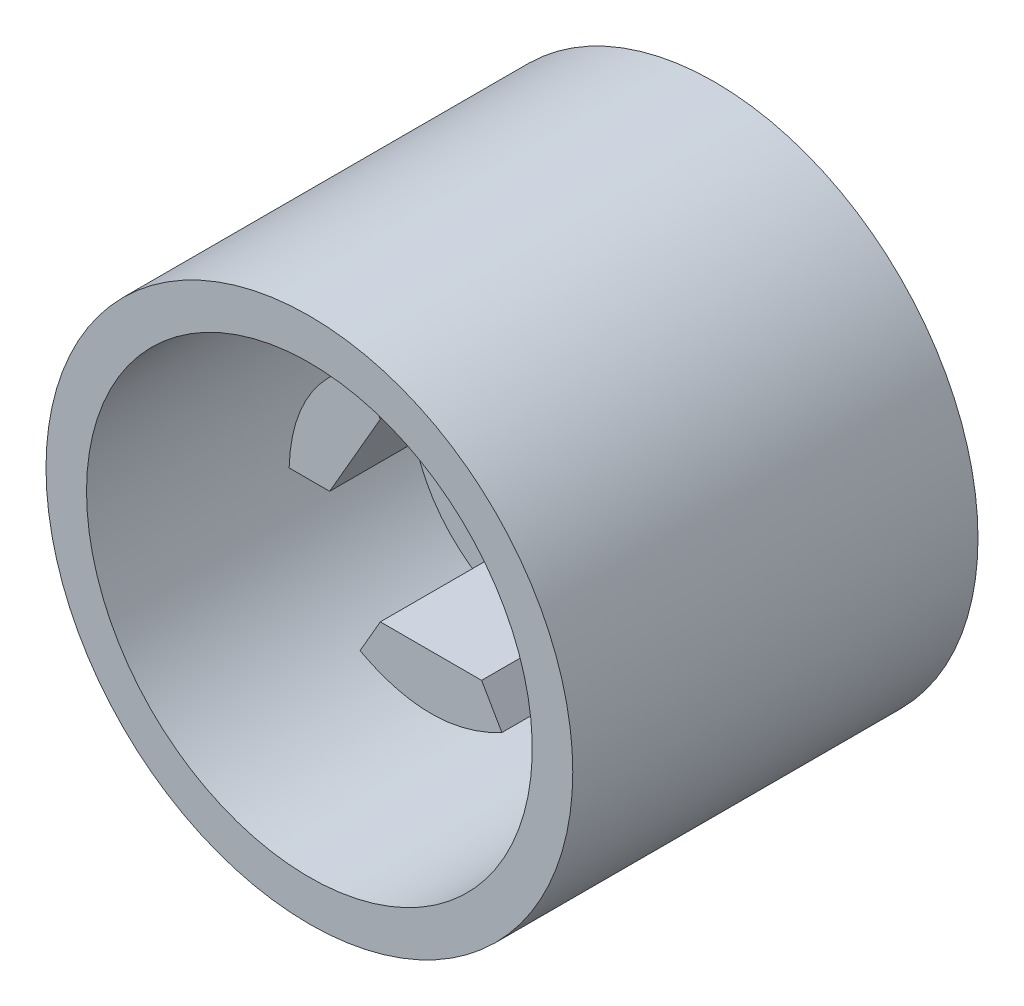
ISO-10303-21;
HEADER;
FILE_DESCRIPTION(('STEP AP214'),'2;1');
FILE_NAME('part.step','',(''),(''),'','','');
FILE_SCHEMA(('AUTOMOTIVE_DESIGN { 1 0 10303 214 1 1 1 1 }'));
ENDSEC;
DATA;
#1=APPLICATION_CONTEXT('core data for automotive mechanical design processes');
#2=APPLICATION_PROTOCOL_DEFINITION('international standard','automotive_design',2000,#1);
#3=PRODUCT_CONTEXT('',#1,'mechanical');
#4=PRODUCT('Part','Part','',(#3));
#5=PRODUCT_RELATED_PRODUCT_CATEGORY('part','',(#4));
#6=PRODUCT_DEFINITION_FORMATION('','',#4);
#7=PRODUCT_DEFINITION_CONTEXT('part definition',#1,'design');
#8=PRODUCT_DEFINITION('design','',#6,#7);
#9=PRODUCT_DEFINITION_SHAPE('','',#8);
#10=(LENGTH_UNIT() NAMED_UNIT(*) SI_UNIT(.MILLI.,.METRE.));
#11=(NAMED_UNIT(*) PLANE_ANGLE_UNIT() SI_UNIT($,.RADIAN.));
#12=(NAMED_UNIT(*) SI_UNIT($,.STERADIAN.) SOLID_ANGLE_UNIT());
#13=UNCERTAINTY_MEASURE_WITH_UNIT(LENGTH_MEASURE(1.E-05),#10,'distance_accuracy_value','');
#14=(GEOMETRIC_REPRESENTATION_CONTEXT(3) GLOBAL_UNCERTAINTY_ASSIGNED_CONTEXT((#13)) GLOBAL_UNIT_ASSIGNED_CONTEXT((#10,
#11,#12)) REPRESENTATION_CONTEXT('',''));
#15=CARTESIAN_POINT('',(0.,0.,0.));
#16=DIRECTION('',(0.,0.,1.));
#17=DIRECTION('',(1.,0.,0.));
#18=AXIS2_PLACEMENT_3D('',#15,#16,#17);
#19=CARTESIAN_POINT('',(0.,0.,-6.28644006717656));
#20=DIRECTION('',(0.,0.,-1.));
#21=DIRECTION('',(-1.,0.,0.));
#22=AXIS2_PLACEMENT_3D('',#19,#20,#21);
#23=PLANE('',#22);
#24=DIRECTION('',(-0.499999999999991,-0.866025403784443,0.));
#25=VECTOR('',#24,1.);
#26=CARTESIAN_POINT('',(-6.82616625304671,-3.43703832126951,-6.28644006717656));
#27=LINE('',#26,#25);
#28=CARTESIAN_POINT('',(-6.82616625304671,-3.43703832126951,-6.28644006717656));
#29=VERTEX_POINT('',#28);
#30=CARTESIAN_POINT('',(-7.6199162530467,-4.81185364977731,-6.28644006717656));
#31=VERTEX_POINT('',#30);
#32=EDGE_CURVE('E224',#29,#31,#27,.T.);
#33=ORIENTED_EDGE('',*,*,#32,.F.);
#34=DIRECTION('',(0.500000000000007,-0.866025403784435,0.));
#35=VECTOR('',#34,1.);
#36=CARTESIAN_POINT('',(-8.81054125304674,0.,-6.28644006717656));
#37=LINE('',#36,#35);
#38=CARTESIAN_POINT('',(-8.81054125304674,0.,-6.28644006717656));
#39=VERTEX_POINT('',#38);
#40=EDGE_CURVE('E409',#39,#29,#37,.T.);
#41=ORIENTED_EDGE('',*,*,#40,.F.);
#42=DIRECTION('',(-1.,0.,0.));
#43=VECTOR('',#42,1.);
#44=CARTESIAN_POINT('',(-8.81054125304674,0.,-6.28644006717656));
#45=LINE('',#44,#43);
#46=CARTESIAN_POINT('',(-10.3980412530467,0.,-6.28644006717656));
#47=VERTEX_POINT('',#46);
#48=EDGE_CURVE('E310',#39,#47,#45,.T.);
#49=ORIENTED_EDGE('',*,*,#48,.T.);
#50=CARTESIAN_POINT('',(-4.84179125304674,0.,-6.28644006717656));
#51=DIRECTION('',(0.,0.,-1.));
#52=DIRECTION('',(-1.,0.,0.));
#53=AXIS2_PLACEMENT_3D('',#50,#51,#52);
#54=CIRCLE('',#53,5.55625);
#55=EDGE_CURVE('E98',#31,#47,#54,.T.);
#56=ORIENTED_EDGE('',*,*,#55,.F.);
#57=EDGE_LOOP('',(#33,#41,#49,#56));
#58=FACE_BOUND('',#57,.T.);
#59=ADVANCED_FACE('F75',(#58),#23,.F.);
#60=CARTESIAN_POINT('',(-7.6199162530467,-4.81185364977731,-6.28644006717656));
#61=CARTESIAN_POINT('',(-4.84179125304668,-6.30064635022272,-6.28644006717656));
#62=CARTESIAN_POINT('',(-2.06366625304668,-4.81185364977725,-6.28644006717656));
#63=B_SPLINE_CURVE_WITH_KNOTS('',2,(#60,#61,#62),.UNSPECIFIED.,.F.,.F.,(3,3),(0.,1.),.UNSPECIFIED.);
#64=CARTESIAN_POINT('',(-4.84179125304672,-5.55625,-6.28644006717656));
#65=VERTEX_POINT('',#64);
#66=EDGE_CURVE('E227',#31,#65,#63,.T.);
#67=ORIENTED_EDGE('',*,*,#66,.F.);
#68=EDGE_CURVE('E510',#65,#31,#54,.T.);
#69=ORIENTED_EDGE('',*,*,#68,.F.);
#70=EDGE_LOOP('',(#67,#69));
#71=FACE_BOUND('',#70,.T.);
#72=ADVANCED_FACE('F400',(#71),#23,.F.);
#73=CARTESIAN_POINT('',(-2.06366625304668,-4.81185364977725,-6.28644006717656));
#74=VERTEX_POINT('',#73);
#75=EDGE_CURVE('E517',#65,#74,#63,.T.);
#76=ORIENTED_EDGE('',*,*,#75,.F.);
#77=EDGE_CURVE('E507',#74,#65,#54,.T.);
#78=ORIENTED_EDGE('',*,*,#77,.F.);
#79=EDGE_LOOP('',(#76,#78));
#80=FACE_BOUND('',#79,.T.);
#81=ADVANCED_FACE('F374',(#80),#23,.F.);
#82=DIRECTION('',(0.499999999999995,0.866025403784442,0.));
#83=VECTOR('',#82,1.);
#84=CARTESIAN_POINT('',(-2.8574162530467,-3.43703832126947,-6.28644006717656));
#85=LINE('',#84,#83);
#86=CARTESIAN_POINT('',(-2.8574162530467,-3.43703832126947,-6.28644006717656));
#87=VERTEX_POINT('',#86);
#88=CARTESIAN_POINT('',(-0.873041253046741,0.,-6.28644006717656));
#89=VERTEX_POINT('',#88);
#90=EDGE_CURVE('E430',#87,#89,#85,.T.);
#91=ORIENTED_EDGE('',*,*,#90,.F.);
#92=DIRECTION('',(0.50000000000001,-0.866025403784433,0.));
#93=VECTOR('',#92,1.);
#94=CARTESIAN_POINT('',(-2.8574162530467,-3.43703832126947,-6.28644006717656));
#95=LINE('',#94,#93);
#96=EDGE_CURVE('E201',#87,#74,#95,.T.);
#97=ORIENTED_EDGE('',*,*,#96,.T.);
#98=CARTESIAN_POINT('',(0.714458746953259,0.,-6.28644006717656));
#99=VERTEX_POINT('',#98);
#100=EDGE_CURVE('E504',#99,#74,#54,.T.);
#101=ORIENTED_EDGE('',*,*,#100,.F.);
#102=DIRECTION('',(1.,0.,0.));
#103=VECTOR('',#102,1.);
#104=CARTESIAN_POINT('',(-0.873041253046741,0.,-6.28644006717656));
#105=LINE('',#104,#103);
#106=EDGE_CURVE('E280',#89,#99,#105,.T.);
#107=ORIENTED_EDGE('',*,*,#106,.F.);
#108=EDGE_LOOP('',(#91,#97,#101,#107));
#109=FACE_BOUND('',#108,.T.);
#110=ADVANCED_FACE('F370',(#109),#23,.F.);
#111=CARTESIAN_POINT('',(0.714458746953259,0.,-6.28644006717656));
#112=CARTESIAN_POINT('',(0.61873942481752,3.14328803133963,-6.28644006717656));
#113=CARTESIAN_POINT('',(-2.06366625304675,4.81185364977729,-6.28644006717656));
#114=B_SPLINE_CURVE_WITH_KNOTS('',2,(#111,#112,#113),.UNSPECIFIED.,.F.,.F.,(3,3),(0.,1.),.UNSPECIFIED.);
#115=CARTESIAN_POINT('',(0.,2.7256139720107,-6.28644006717656));
#116=VERTEX_POINT('',#115);
#117=EDGE_CURVE('E284',#99,#116,#114,.T.);
#118=ORIENTED_EDGE('',*,*,#117,.F.);
#119=EDGE_CURVE('E501',#116,#99,#54,.T.);
#120=ORIENTED_EDGE('',*,*,#119,.F.);
#121=EDGE_LOOP('',(#118,#120));
#122=FACE_BOUND('',#121,.T.);
#123=ADVANCED_FACE('F373',(#122),#23,.F.);
#124=CARTESIAN_POINT('',(-2.06366625304675,4.81185364977729,-6.28644006717656));
#125=VERTEX_POINT('',#124);
#126=EDGE_CURVE('E283',#116,#125,#114,.T.);
#127=ORIENTED_EDGE('',*,*,#126,.F.);
#128=EDGE_CURVE('E498',#125,#116,#54,.T.);
#129=ORIENTED_EDGE('',*,*,#128,.F.);
#130=EDGE_LOOP('',(#127,#129));
#131=FACE_BOUND('',#130,.T.);
#132=ADVANCED_FACE('F556',(#131),#23,.F.);
#133=DIRECTION('',(-0.499999999999998,-0.86602540378444,0.));
#134=VECTOR('',#133,1.);
#135=CARTESIAN_POINT('',(-2.85741625304675,3.4370383212695,-6.28644006717656));
#136=LINE('',#135,#134);
#137=CARTESIAN_POINT('',(-2.85741625304675,3.4370383212695,-6.28644006717656));
#138=VERTEX_POINT('',#137);
#139=EDGE_CURVE('E289',#125,#138,#136,.T.);
#140=ORIENTED_EDGE('',*,*,#139,.F.);
#141=CARTESIAN_POINT('',(-7.61991625304676,4.81185364977727,-6.28644006717656));
#142=VERTEX_POINT('',#141);
#143=EDGE_CURVE('E495',#142,#125,#54,.T.);
#144=ORIENTED_EDGE('',*,*,#143,.F.);
#145=DIRECTION('',(-0.500000000000004,0.866025403784436,0.));
#146=VECTOR('',#145,1.);
#147=CARTESIAN_POINT('',(-6.82616625304676,3.43703832126948,-6.28644006717656));
#148=LINE('',#147,#146);
#149=CARTESIAN_POINT('',(-6.82616625304676,3.43703832126948,-6.28644006717656));
#150=VERTEX_POINT('',#149);
#151=EDGE_CURVE('E316',#150,#142,#148,.T.);
#152=ORIENTED_EDGE('',*,*,#151,.F.);
#153=DIRECTION('',(-1.,0.,0.));
#154=VECTOR('',#153,1.);
#155=CARTESIAN_POINT('',(-2.85741625304675,3.4370383212695,-6.28644006717656));
#156=LINE('',#155,#154);
#157=EDGE_CURVE('E424',#138,#150,#156,.T.);
#158=ORIENTED_EDGE('',*,*,#157,.F.);
#159=EDGE_LOOP('',(#140,#144,#152,#158));
#160=FACE_BOUND('',#159,.T.);
#161=ADVANCED_FACE('F567',(#160),#23,.F.);
#162=CARTESIAN_POINT('',(-7.61991625304676,4.81185364977727,-6.28644006717656));
#163=CARTESIAN_POINT('',(-10.3011237188789,3.14540841779209,-6.28644006717656));
#164=CARTESIAN_POINT('',(-10.3980412530467,0.,-6.28644006717656));
#165=B_SPLINE_CURVE_WITH_KNOTS('',2,(#162,#163,#164),.UNSPECIFIED.,.F.,.F.,(3,3),(0.,1.),.UNSPECIFIED.);
#166=CARTESIAN_POINT('',(-9.67463892972956,2.74144075195534,-6.28644006717656));
#167=VERTEX_POINT('',#166);
#168=EDGE_CURVE('E12',#167,#47,#165,.T.);
#169=ORIENTED_EDGE('',*,*,#168,.F.);
#170=EDGE_CURVE('E472',#47,#167,#54,.T.);
#171=ORIENTED_EDGE('',*,*,#170,.F.);
#172=EDGE_LOOP('',(#169,#171));
#173=FACE_BOUND('',#172,.T.);
#174=ADVANCED_FACE('F571',(#173),#23,.F.);
#175=EDGE_CURVE('E86',#142,#167,#165,.T.);
#176=ORIENTED_EDGE('',*,*,#175,.F.);
#177=EDGE_CURVE('E476',#167,#142,#54,.T.);
#178=ORIENTED_EDGE('',*,*,#177,.F.);
#179=EDGE_LOOP('',(#176,#178));
#180=FACE_BOUND('',#179,.T.);
#181=ADVANCED_FACE('F376',(#180),#23,.F.);
#182=CARTESIAN_POINT('',(0.,0.,-11.0489400671766));
#183=DIRECTION('',(0.,0.,-1.));
#184=DIRECTION('',(-1.,0.,0.));
#185=AXIS2_PLACEMENT_3D('',#182,#183,#184);
#186=PLANE('',#185);
#187=CARTESIAN_POINT('',(-4.84179125304674,0.,-11.0489400671766));
#188=DIRECTION('',(0.,0.,-1.));
#189=DIRECTION('',(-1.,0.,0.));
#190=AXIS2_PLACEMENT_3D('',#187,#188,#189);
#191=CIRCLE('',#190,8.73125);
#192=CARTESIAN_POINT('',(-13.5730412530467,0.,-11.0489400671766));
#193=VERTEX_POINT('',#192);
#194=EDGE_CURVE('E79',#193,#193,#191,.T.);
#195=ORIENTED_EDGE('',*,*,#194,.F.);
#196=EDGE_LOOP('',(#195));
#197=FACE_BOUND('',#196,.T.);
#198=CARTESIAN_POINT('',(-4.84179125304674,0.,-11.0489400671766));
#199=DIRECTION('',(0.,0.,-1.));
#200=DIRECTION('',(-1.,0.,0.));
#201=AXIS2_PLACEMENT_3D('',#198,#199,#200);
#202=CIRCLE('',#201,5.55625);
#203=CARTESIAN_POINT('',(-10.3980412530467,0.,-11.0489400671766));
#204=VERTEX_POINT('',#203);
#205=EDGE_CURVE('E468',#204,#204,#202,.T.);
#206=ORIENTED_EDGE('',*,*,#205,.T.);
#207=EDGE_LOOP('',(#206));
#208=FACE_BOUND('',#207,.T.);
#209=ADVANCED_FACE('F77',(#197,#208),#186,.F.);
#210=CARTESIAN_POINT('',(-4.84179125304674,0.,-12.6364400671766));
#211=DIRECTION('',(0.,0.,-1.));
#212=DIRECTION('',(-1.,0.,0.));
#213=AXIS2_PLACEMENT_3D('',#210,#211,#212);
#214=CYLINDRICAL_SURFACE('',#213,8.73125);
#215=CARTESIAN_POINT('',(-4.84179125304674,0.,3.23855993282344));
#216=DIRECTION('',(0.,0.,-1.));
#217=DIRECTION('',(-1.,0.,0.));
#218=AXIS2_PLACEMENT_3D('',#215,#216,#217);
#219=CIRCLE('',#218,8.73125);
#220=CARTESIAN_POINT('',(-13.5730412530467,0.,3.23855993282344));
#221=VERTEX_POINT('',#220);
#222=EDGE_CURVE('E483',#221,#221,#219,.T.);
#223=ORIENTED_EDGE('',*,*,#222,.F.);
#224=EDGE_LOOP('',(#223));
#225=FACE_BOUND('',#224,.T.);
#226=ORIENTED_EDGE('',*,*,#194,.T.);
#227=EDGE_LOOP('',(#226));
#228=FACE_BOUND('',#227,.T.);
#229=ADVANCED_FACE('F389',(#225,#228),#214,.F.);
#230=CARTESIAN_POINT('',(0.,0.,3.23855993282344));
#231=DIRECTION('',(0.,0.,-1.));
#232=DIRECTION('',(-1.,0.,0.));
#233=AXIS2_PLACEMENT_3D('',#230,#231,#232);
#234=PLANE('',#233);
#235=CARTESIAN_POINT('',(-4.84179125304674,0.,3.23855993282344));
#236=DIRECTION('',(0.,0.,-1.));
#237=DIRECTION('',(-1.,0.,0.));
#238=AXIS2_PLACEMENT_3D('',#235,#236,#237);
#239=CIRCLE('',#238,10.31875);
#240=CARTESIAN_POINT('',(-15.1605412530467,0.,3.23855993282344));
#241=VERTEX_POINT('',#240);
#242=EDGE_CURVE('E480',#241,#241,#239,.T.);
#243=ORIENTED_EDGE('',*,*,#242,.F.);
#244=EDGE_LOOP('',(#243));
#245=FACE_BOUND('',#244,.T.);
#246=ORIENTED_EDGE('',*,*,#222,.T.);
#247=EDGE_LOOP('',(#246));
#248=FACE_BOUND('',#247,.T.);
#249=ADVANCED_FACE('F386',(#245,#248),#234,.F.);
#250=CARTESIAN_POINT('',(-4.84179125304674,0.,-12.6364400671766));
#251=DIRECTION('',(0.,0.,-1.));
#252=DIRECTION('',(-1.,0.,0.));
#253=AXIS2_PLACEMENT_3D('',#250,#251,#252);
#254=CYLINDRICAL_SURFACE('',#253,10.31875);
#255=ORIENTED_EDGE('',*,*,#242,.T.);
#256=EDGE_LOOP('',(#255));
#257=FACE_BOUND('',#256,.T.);
#258=CARTESIAN_POINT('',(-4.84179125304674,0.,-12.6364400671766));
#259=DIRECTION('',(0.,0.,-1.));
#260=DIRECTION('',(-1.,0.,0.));
#261=AXIS2_PLACEMENT_3D('',#258,#259,#260);
#262=CIRCLE('',#261,10.31875);
#263=CARTESIAN_POINT('',(-15.1605412530467,0.,-12.6364400671766));
#264=VERTEX_POINT('',#263);
#265=EDGE_CURVE('E475',#264,#264,#262,.T.);
#266=ORIENTED_EDGE('',*,*,#265,.F.);
#267=EDGE_LOOP('',(#266));
#268=FACE_BOUND('',#267,.T.);
#269=ADVANCED_FACE('F382',(#257,#268),#254,.T.);
#270=CARTESIAN_POINT('',(0.,0.,-12.6364400671766));
#271=DIRECTION('',(0.,0.,-1.));
#272=DIRECTION('',(-1.,0.,0.));
#273=AXIS2_PLACEMENT_3D('',#270,#271,#272);
#274=PLANE('',#273);
#275=ORIENTED_EDGE('',*,*,#265,.T.);
#276=EDGE_LOOP('',(#275));
#277=FACE_BOUND('',#276,.T.);
#278=ADVANCED_FACE('F369',(#277),#274,.T.);
#279=CARTESIAN_POINT('',(-4.84179125304674,0.,-12.6364400671766));
#280=DIRECTION('',(0.,0.,-1.));
#281=DIRECTION('',(-1.,0.,0.));
#282=AXIS2_PLACEMENT_3D('',#279,#280,#281);
#283=CYLINDRICAL_SURFACE('',#282,5.55625);
#284=ORIENTED_EDGE('',*,*,#170,.T.);
#285=ORIENTED_EDGE('',*,*,#177,.T.);
#286=ORIENTED_EDGE('',*,*,#143,.T.);
#287=ORIENTED_EDGE('',*,*,#128,.T.);
#288=ORIENTED_EDGE('',*,*,#119,.T.);
#289=ORIENTED_EDGE('',*,*,#100,.T.);
#290=ORIENTED_EDGE('',*,*,#77,.T.);
#291=ORIENTED_EDGE('',*,*,#68,.T.);
#292=ORIENTED_EDGE('',*,*,#55,.T.);
#293=EDGE_LOOP('',(#284,#285,#286,#287,#288,#289,#290,#291,#292));
#294=FACE_BOUND('',#293,.T.);
#295=ORIENTED_EDGE('',*,*,#205,.F.);
#296=EDGE_LOOP('',(#295));
#297=FACE_BOUND('',#296,.T.);
#298=ADVANCED_FACE('F365',(#294,#297),#283,.T.);
#299=CARTESIAN_POINT('',(-2.8574162530467,-3.43703832126947,-6.28644006717656));
#300=DIRECTION('',(-0.866025403784442,0.499999999999995,0.));
#301=DIRECTION('',(-0.499999999999995,-0.866025403784442,0.));
#302=AXIS2_PLACEMENT_3D('',#299,#300,#301);
#303=PLANE('',#302);
#304=DIRECTION('',(0.499999999999995,0.866025403784442,0.));
#305=VECTOR('',#304,1.);
#306=CARTESIAN_POINT('',(-2.8574162530467,-3.43703832126947,-11.0489400671766));
#307=LINE('',#306,#305);
#308=CARTESIAN_POINT('',(-2.8574162530467,-3.43703832126947,-11.0489400671766));
#309=VERTEX_POINT('',#308);
#310=CARTESIAN_POINT('',(-0.87304125304674,0.,-11.0489400671766));
#311=VERTEX_POINT('',#310);
#312=EDGE_CURVE('E434',#309,#311,#307,.T.);
#313=ORIENTED_EDGE('',*,*,#312,.F.);
#314=DIRECTION('',(0.,0.,-1.));
#315=VECTOR('',#314,1.);
#316=CARTESIAN_POINT('',(-2.8574162530467,-3.43703832126947,-6.28644006717656));
#317=LINE('',#316,#315);
#318=EDGE_CURVE('E421',#87,#309,#317,.T.);
#319=ORIENTED_EDGE('',*,*,#318,.F.);
#320=ORIENTED_EDGE('',*,*,#90,.T.);
#321=DIRECTION('',(0.,0.,-1.));
#322=VECTOR('',#321,1.);
#323=CARTESIAN_POINT('',(-0.87304125304674,0.,-6.28644006717656));
#324=LINE('',#323,#322);
#325=EDGE_CURVE('E464',#89,#311,#324,.T.);
#326=ORIENTED_EDGE('',*,*,#325,.T.);
#327=EDGE_LOOP('',(#313,#319,#320,#326));
#328=FACE_BOUND('',#327,.T.);
#329=ADVANCED_FACE('F361',(#328),#303,.T.);
#330=CARTESIAN_POINT('',(-0.87304125304674,0.,-6.28644006717656));
#331=DIRECTION('',(-0.866025403784438,-0.500000000000001,0.));
#332=DIRECTION('',(0.500000000000001,-0.866025403784438,0.));
#333=AXIS2_PLACEMENT_3D('',#330,#331,#332);
#334=PLANE('',#333);
#335=DIRECTION('',(-0.500000000000001,0.866025403784438,0.));
#336=VECTOR('',#335,1.);
#337=CARTESIAN_POINT('',(-0.87304125304674,0.,-11.0489400671766));
#338=LINE('',#337,#336);
#339=CARTESIAN_POINT('',(-2.85741625304675,3.4370383212695,-11.0489400671766));
#340=VERTEX_POINT('',#339);
#341=EDGE_CURVE('E438',#311,#340,#338,.T.);
#342=ORIENTED_EDGE('',*,*,#341,.F.);
#343=ORIENTED_EDGE('',*,*,#325,.F.);
#344=DIRECTION('',(0.,0.,-1.));
#345=VECTOR('',#344,1.);
#346=CARTESIAN_POINT('',(-0.873041253046741,0.,-1.52394006717656));
#347=LINE('',#346,#345);
#348=CARTESIAN_POINT('',(-0.873041253046741,0.,-1.52394006717656));
#349=VERTEX_POINT('',#348);
#350=EDGE_CURVE('E307',#349,#89,#347,.T.);
#351=ORIENTED_EDGE('',*,*,#350,.F.);
#352=DIRECTION('',(0.500000000000001,-0.866025403784438,0.));
#353=VECTOR('',#352,1.);
#354=CARTESIAN_POINT('',(-2.85741625304675,3.4370383212695,-1.52394006717656));
#355=LINE('',#354,#353);
#356=CARTESIAN_POINT('',(-2.85741625304675,3.4370383212695,-1.52394006717656));
#357=VERTEX_POINT('',#356);
#358=EDGE_CURVE('E296',#357,#349,#355,.T.);
#359=ORIENTED_EDGE('',*,*,#358,.F.);
#360=DIRECTION('',(0.,0.,-1.));
#361=VECTOR('',#360,1.);
#362=CARTESIAN_POINT('',(-2.85741625304675,3.4370383212695,-1.52394006717656));
#363=LINE('',#362,#361);
#364=EDGE_CURVE('E279',#357,#138,#363,.T.);
#365=ORIENTED_EDGE('',*,*,#364,.T.);
#366=DIRECTION('',(0.,0.,-1.));
#367=VECTOR('',#366,1.);
#368=CARTESIAN_POINT('',(-2.85741625304675,3.4370383212695,-6.28644006717656));
#369=LINE('',#368,#367);
#370=EDGE_CURVE('E461',#138,#340,#369,.T.);
#371=ORIENTED_EDGE('',*,*,#370,.T.);
#372=EDGE_LOOP('',(#342,#343,#351,#359,#365,#371));
#373=FACE_BOUND('',#372,.T.);
#374=ADVANCED_FACE('F357',(#373),#334,.T.);
#375=CARTESIAN_POINT('',(-2.85741625304675,3.4370383212695,-6.28644006717656));
#376=DIRECTION('',(0.,-1.,0.));
#377=DIRECTION('',(1.,0.,0.));
#378=AXIS2_PLACEMENT_3D('',#375,#376,#377);
#379=PLANE('',#378);
#380=DIRECTION('',(-1.,0.,0.));
#381=VECTOR('',#380,1.);
#382=CARTESIAN_POINT('',(-2.85741625304675,3.4370383212695,-11.0489400671766));
#383=LINE('',#382,#381);
#384=CARTESIAN_POINT('',(-6.82616625304676,3.43703832126948,-11.0489400671766));
#385=VERTEX_POINT('',#384);
#386=EDGE_CURVE('E443',#340,#385,#383,.T.);
#387=ORIENTED_EDGE('',*,*,#386,.F.);
#388=ORIENTED_EDGE('',*,*,#370,.F.);
#389=ORIENTED_EDGE('',*,*,#157,.T.);
#390=DIRECTION('',(0.,0.,-1.));
#391=VECTOR('',#390,1.);
#392=CARTESIAN_POINT('',(-6.82616625304676,3.43703832126948,-6.28644006717656));
#393=LINE('',#392,#391);
#394=EDGE_CURVE('E458',#150,#385,#393,.T.);
#395=ORIENTED_EDGE('',*,*,#394,.T.);
#396=EDGE_LOOP('',(#387,#388,#389,#395));
#397=FACE_BOUND('',#396,.T.);
#398=ADVANCED_FACE('F353',(#397),#379,.T.);
#399=CARTESIAN_POINT('',(-6.82616625304676,3.43703832126948,-6.28644006717656));
#400=DIRECTION('',(0.866025403784442,-0.499999999999995,0.));
#401=DIRECTION('',(0.499999999999995,0.866025403784442,0.));
#402=AXIS2_PLACEMENT_3D('',#399,#400,#401);
#403=PLANE('',#402);
#404=DIRECTION('',(-0.499999999999995,-0.866025403784442,0.));
#405=VECTOR('',#404,1.);
#406=CARTESIAN_POINT('',(-6.82616625304676,3.43703832126948,-11.0489400671766));
#407=LINE('',#406,#405);
#408=CARTESIAN_POINT('',(-8.81054125304674,0.,-11.0489400671766));
#409=VERTEX_POINT('',#408);
#410=EDGE_CURVE('E447',#385,#409,#407,.T.);
#411=ORIENTED_EDGE('',*,*,#410,.F.);
#412=ORIENTED_EDGE('',*,*,#394,.F.);
#413=DIRECTION('',(0.,0.,-1.));
#414=VECTOR('',#413,1.);
#415=CARTESIAN_POINT('',(-6.82616625304676,3.43703832126948,-1.52394006717656));
#416=LINE('',#415,#414);
#417=CARTESIAN_POINT('',(-6.82616625304676,3.43703832126948,-1.52394006717656));
#418=VERTEX_POINT('',#417);
#419=EDGE_CURVE('E439',#418,#150,#416,.T.);
#420=ORIENTED_EDGE('',*,*,#419,.F.);
#421=DIRECTION('',(-0.499999999999995,-0.866025403784442,0.));
#422=VECTOR('',#421,1.);
#423=CARTESIAN_POINT('',(-6.82616625304676,3.43703832126948,-1.52394006717656));
#424=LINE('',#423,#422);
#425=CARTESIAN_POINT('',(-8.81054125304674,0.,-1.52394006717656));
#426=VERTEX_POINT('',#425);
#427=EDGE_CURVE('E311',#418,#426,#424,.T.);
#428=ORIENTED_EDGE('',*,*,#427,.T.);
#429=DIRECTION('',(0.,0.,-1.));
#430=VECTOR('',#429,1.);
#431=CARTESIAN_POINT('',(-8.81054125304674,0.,-1.52394006717656));
#432=LINE('',#431,#430);
#433=EDGE_CURVE('E600',#426,#39,#432,.T.);
#434=ORIENTED_EDGE('',*,*,#433,.T.);
#435=DIRECTION('',(0.,0.,-1.));
#436=VECTOR('',#435,1.);
#437=CARTESIAN_POINT('',(-8.81054125304674,0.,-6.28644006717656));
#438=LINE('',#437,#436);
#439=EDGE_CURVE('E420',#39,#409,#438,.T.);
#440=ORIENTED_EDGE('',*,*,#439,.T.);
#441=EDGE_LOOP('',(#411,#412,#420,#428,#434,#440));
#442=FACE_BOUND('',#441,.T.);
#443=ADVANCED_FACE('F349',(#442),#403,.T.);
#444=CARTESIAN_POINT('',(-8.81054125304674,0.,-6.28644006717656));
#445=DIRECTION('',(0.866025403784435,0.500000000000007,0.));
#446=DIRECTION('',(-0.500000000000007,0.866025403784435,0.));
#447=AXIS2_PLACEMENT_3D('',#444,#445,#446);
#448=PLANE('',#447);
#449=DIRECTION('',(0.500000000000007,-0.866025403784435,0.));
#450=VECTOR('',#449,1.);
#451=CARTESIAN_POINT('',(-8.81054125304674,0.,-11.0489400671766));
#452=LINE('',#451,#450);
#453=CARTESIAN_POINT('',(-6.82616625304671,-3.43703832126951,-11.0489400671766));
#454=VERTEX_POINT('',#453);
#455=EDGE_CURVE('E451',#409,#454,#452,.T.);
#456=ORIENTED_EDGE('',*,*,#455,.F.);
#457=ORIENTED_EDGE('',*,*,#439,.F.);
#458=ORIENTED_EDGE('',*,*,#40,.T.);
#459=DIRECTION('',(0.,0.,-1.));
#460=VECTOR('',#459,1.);
#461=CARTESIAN_POINT('',(-6.82616625304671,-3.43703832126951,-6.28644006717656));
#462=LINE('',#461,#460);
#463=EDGE_CURVE('E414',#29,#454,#462,.T.);
#464=ORIENTED_EDGE('',*,*,#463,.T.);
#465=EDGE_LOOP('',(#456,#457,#458,#464));
#466=FACE_BOUND('',#465,.T.);
#467=ADVANCED_FACE('F346',(#466),#448,.T.);
#468=CARTESIAN_POINT('',(-6.82616625304671,-3.43703832126951,-6.28644006717656));
#469=DIRECTION('',(0.,1.,0.));
#470=DIRECTION('',(-1.,0.,0.));
#471=AXIS2_PLACEMENT_3D('',#468,#469,#470);
#472=PLANE('',#471);
#473=DIRECTION('',(1.,0.,0.));
#474=VECTOR('',#473,1.);
#475=CARTESIAN_POINT('',(-6.82616625304671,-3.43703832126951,-11.0489400671766));
#476=LINE('',#475,#474);
#477=EDGE_CURVE('E416',#454,#309,#476,.T.);
#478=ORIENTED_EDGE('',*,*,#477,.F.);
#479=ORIENTED_EDGE('',*,*,#463,.F.);
#480=DIRECTION('',(0.,0.,-1.));
#481=VECTOR('',#480,1.);
#482=CARTESIAN_POINT('',(-6.82616625304671,-3.43703832126951,-1.52394006717656));
#483=LINE('',#482,#481);
#484=CARTESIAN_POINT('',(-6.82616625304671,-3.43703832126951,-1.52394006717656));
#485=VERTEX_POINT('',#484);
#486=EDGE_CURVE('E221',#485,#29,#483,.T.);
#487=ORIENTED_EDGE('',*,*,#486,.F.);
#488=DIRECTION('',(1.,0.,0.));
#489=VECTOR('',#488,1.);
#490=CARTESIAN_POINT('',(-6.82616625304671,-3.43703832126951,-1.52394006717656));
#491=LINE('',#490,#489);
#492=CARTESIAN_POINT('',(-2.8574162530467,-3.43703832126947,-1.52394006717656));
#493=VERTEX_POINT('',#492);
#494=EDGE_CURVE('E212',#485,#493,#491,.T.);
#495=ORIENTED_EDGE('',*,*,#494,.T.);
#496=DIRECTION('',(0.,0.,-1.));
#497=VECTOR('',#496,1.);
#498=CARTESIAN_POINT('',(-2.8574162530467,-3.43703832126947,-1.52394006717656));
#499=LINE('',#498,#497);
#500=EDGE_CURVE('E195',#493,#87,#499,.T.);
#501=ORIENTED_EDGE('',*,*,#500,.T.);
#502=ORIENTED_EDGE('',*,*,#318,.T.);
#503=EDGE_LOOP('',(#478,#479,#487,#495,#501,#502));
#504=FACE_BOUND('',#503,.T.);
#505=ADVANCED_FACE('F219',(#504),#472,.T.);
#506=CARTESIAN_POINT('',(0.,0.,-11.0489400671766));
#507=DIRECTION('',(0.,0.,-1.));
#508=DIRECTION('',(-1.,0.,0.));
#509=AXIS2_PLACEMENT_3D('',#506,#507,#508);
#510=PLANE('',#509);
#511=ORIENTED_EDGE('',*,*,#477,.T.);
#512=ORIENTED_EDGE('',*,*,#312,.T.);
#513=ORIENTED_EDGE('',*,*,#341,.T.);
#514=ORIENTED_EDGE('',*,*,#386,.T.);
#515=ORIENTED_EDGE('',*,*,#410,.T.);
#516=ORIENTED_EDGE('',*,*,#455,.T.);
#517=EDGE_LOOP('',(#511,#512,#513,#514,#515,#516));
#518=FACE_BOUND('',#517,.T.);
#519=ADVANCED_FACE('F345',(#518),#510,.F.);
#520=CARTESIAN_POINT('',(-6.82616625304676,3.43703832126948,-1.52394006717656));
#521=DIRECTION('',(-0.866025403784436,-0.500000000000004,0.));
#522=DIRECTION('',(0.500000000000004,-0.866025403784436,0.));
#523=AXIS2_PLACEMENT_3D('',#520,#521,#522);
#524=PLANE('',#523);
#525=ORIENTED_EDGE('',*,*,#151,.T.);
#526=DIRECTION('',(0.,0.,-1.));
#527=VECTOR('',#526,1.);
#528=CARTESIAN_POINT('',(-7.61991625304676,4.81185364977727,-1.52394006717656));
#529=LINE('',#528,#527);
#530=CARTESIAN_POINT('',(-7.61991625304676,4.81185364977727,-1.52394006717656));
#531=VERTEX_POINT('',#530);
#532=EDGE_CURVE('E590',#531,#142,#529,.T.);
#533=ORIENTED_EDGE('',*,*,#532,.F.);
#534=DIRECTION('',(-0.500000000000004,0.866025403784436,0.));
#535=VECTOR('',#534,1.);
#536=CARTESIAN_POINT('',(-6.82616625304676,3.43703832126948,-1.52394006717656));
#537=LINE('',#536,#535);
#538=EDGE_CURVE('E326',#418,#531,#537,.T.);
#539=ORIENTED_EDGE('',*,*,#538,.F.);
#540=ORIENTED_EDGE('',*,*,#419,.T.);
#541=EDGE_LOOP('',(#525,#533,#539,#540));
#542=FACE_BOUND('',#541,.T.);
#543=ADVANCED_FACE('F337',(#542),#524,.F.);
#544=CARTESIAN_POINT('',(-7.61991625304676,4.81185364977727,-1.52394006717656));
#545=CARTESIAN_POINT('',(-10.3011237188789,3.14540841779209,-1.52394006717656));
#546=CARTESIAN_POINT('',(-10.3980412530467,0.,-1.52394006717656));
#547=B_SPLINE_CURVE_WITH_KNOTS('',2,(#544,#545,#546),.UNSPECIFIED.,.F.,.F.,(3,3),(0.,1.),.UNSPECIFIED.);
#548=DIRECTION('',(0.,0.,-1.));
#549=VECTOR('',#548,1.);
#550=SURFACE_OF_LINEAR_EXTRUSION('',#547,#549);
#551=ORIENTED_EDGE('',*,*,#175,.T.);
#552=ORIENTED_EDGE('',*,*,#168,.T.);
#553=DIRECTION('',(0.,0.,-1.));
#554=VECTOR('',#553,1.);
#555=CARTESIAN_POINT('',(-10.3980412530467,0.,-1.52394006717656));
#556=LINE('',#555,#554);
#557=CARTESIAN_POINT('',(-10.3980412530467,0.,-1.52394006717656));
#558=VERTEX_POINT('',#557);
#559=EDGE_CURVE('E593',#558,#47,#556,.T.);
#560=ORIENTED_EDGE('',*,*,#559,.F.);
#561=EDGE_CURVE('E320',#531,#558,#547,.T.);
#562=ORIENTED_EDGE('',*,*,#561,.F.);
#563=ORIENTED_EDGE('',*,*,#532,.T.);
#564=EDGE_LOOP('',(#551,#552,#560,#562,#563));
#565=FACE_BOUND('',#564,.T.);
#566=ADVANCED_FACE('F332',(#565),#550,.F.);
#567=CARTESIAN_POINT('',(-8.81054125304674,0.,-1.52394006717656));
#568=DIRECTION('',(0.,-1.,0.));
#569=DIRECTION('',(1.,0.,0.));
#570=AXIS2_PLACEMENT_3D('',#567,#568,#569);
#571=PLANE('',#570);
#572=ORIENTED_EDGE('',*,*,#48,.F.);
#573=ORIENTED_EDGE('',*,*,#433,.F.);
#574=DIRECTION('',(-1.,0.,0.));
#575=VECTOR('',#574,1.);
#576=CARTESIAN_POINT('',(-8.81054125304674,0.,-1.52394006717656));
#577=LINE('',#576,#575);
#578=EDGE_CURVE('E315',#426,#558,#577,.T.);
#579=ORIENTED_EDGE('',*,*,#578,.T.);
#580=ORIENTED_EDGE('',*,*,#559,.T.);
#581=EDGE_LOOP('',(#572,#573,#579,#580));
#582=FACE_BOUND('',#581,.T.);
#583=ADVANCED_FACE('F336',(#582),#571,.T.);
#584=CARTESIAN_POINT('',(-9.65505123596284,2.77566762134037,-1.52394006717656));
#585=DIRECTION('',(0.,0.,-1.));
#586=DIRECTION('',(-1.,0.,0.));
#587=AXIS2_PLACEMENT_3D('',#584,#585,#586);
#588=PLANE('',#587);
#589=ORIENTED_EDGE('',*,*,#427,.F.);
#590=ORIENTED_EDGE('',*,*,#538,.T.);
#591=ORIENTED_EDGE('',*,*,#561,.T.);
#592=ORIENTED_EDGE('',*,*,#578,.F.);
#593=EDGE_LOOP('',(#589,#590,#591,#592));
#594=FACE_BOUND('',#593,.T.);
#595=ADVANCED_FACE('F341',(#594),#588,.F.);
#596=CARTESIAN_POINT('',(-0.873041253046741,0.,-1.52394006717656));
#597=DIRECTION('',(0.,1.,0.));
#598=DIRECTION('',(-1.,0.,0.));
#599=AXIS2_PLACEMENT_3D('',#596,#597,#598);
#600=PLANE('',#599);
#601=ORIENTED_EDGE('',*,*,#106,.T.);
#602=DIRECTION('',(0.,0.,-1.));
#603=VECTOR('',#602,1.);
#604=CARTESIAN_POINT('',(0.714458746953259,0.,-1.52394006717656));
#605=LINE('',#604,#603);
#606=CARTESIAN_POINT('',(0.714458746953259,0.,-1.52394006717656));
#607=VERTEX_POINT('',#606);
#608=EDGE_CURVE('E303',#607,#99,#605,.T.);
#609=ORIENTED_EDGE('',*,*,#608,.F.);
#610=DIRECTION('',(1.,0.,0.));
#611=VECTOR('',#610,1.);
#612=CARTESIAN_POINT('',(-0.873041253046741,0.,-1.52394006717656));
#613=LINE('',#612,#611);
#614=EDGE_CURVE('E272',#349,#607,#613,.T.);
#615=ORIENTED_EDGE('',*,*,#614,.F.);
#616=ORIENTED_EDGE('',*,*,#350,.T.);
#617=EDGE_LOOP('',(#601,#609,#615,#616));
#618=FACE_BOUND('',#617,.T.);
#619=ADVANCED_FACE('F261',(#618),#600,.F.);
#620=CARTESIAN_POINT('',(0.714458746953259,0.,-1.52394006717656));
#621=CARTESIAN_POINT('',(0.61873942481752,3.14328803133963,-1.52394006717656));
#622=CARTESIAN_POINT('',(-2.06366625304675,4.81185364977729,-1.52394006717656));
#623=B_SPLINE_CURVE_WITH_KNOTS('',2,(#620,#621,#622),.UNSPECIFIED.,.F.,.F.,(3,3),(0.,1.),.UNSPECIFIED.);
#624=DIRECTION('',(0.,0.,-1.));
#625=VECTOR('',#624,1.);
#626=SURFACE_OF_LINEAR_EXTRUSION('',#623,#625);
#627=ORIENTED_EDGE('',*,*,#117,.T.);
#628=ORIENTED_EDGE('',*,*,#126,.T.);
#629=DIRECTION('',(0.,0.,-1.));
#630=VECTOR('',#629,1.);
#631=CARTESIAN_POINT('',(-2.06366625304675,4.81185364977729,-1.52394006717656));
#632=LINE('',#631,#630);
#633=CARTESIAN_POINT('',(-2.06366625304675,4.81185364977729,-1.52394006717656));
#634=VERTEX_POINT('',#633);
#635=EDGE_CURVE('E299',#634,#125,#632,.T.);
#636=ORIENTED_EDGE('',*,*,#635,.F.);
#637=EDGE_CURVE('E264',#607,#634,#623,.T.);
#638=ORIENTED_EDGE('',*,*,#637,.F.);
#639=ORIENTED_EDGE('',*,*,#608,.T.);
#640=EDGE_LOOP('',(#627,#628,#636,#638,#639));
#641=FACE_BOUND('',#640,.T.);
#642=ADVANCED_FACE('F256',(#641),#626,.F.);
#643=CARTESIAN_POINT('',(-2.85741625304675,3.4370383212695,-1.52394006717656));
#644=DIRECTION('',(0.86602540378444,-0.499999999999998,0.));
#645=DIRECTION('',(0.499999999999998,0.86602540378444,0.));
#646=AXIS2_PLACEMENT_3D('',#643,#644,#645);
#647=PLANE('',#646);
#648=ORIENTED_EDGE('',*,*,#139,.T.);
#649=ORIENTED_EDGE('',*,*,#364,.F.);
#650=DIRECTION('',(-0.499999999999998,-0.86602540378444,0.));
#651=VECTOR('',#650,1.);
#652=CARTESIAN_POINT('',(-2.85741625304675,3.4370383212695,-1.52394006717656));
#653=LINE('',#652,#651);
#654=EDGE_CURVE('E271',#634,#357,#653,.T.);
#655=ORIENTED_EDGE('',*,*,#654,.F.);
#656=ORIENTED_EDGE('',*,*,#635,.T.);
#657=EDGE_LOOP('',(#648,#649,#655,#656));
#658=FACE_BOUND('',#657,.T.);
#659=ADVANCED_FACE('F252',(#658),#647,.F.);
#660=CARTESIAN_POINT('',(-0.0279321641146137,2.77460742811414,-1.52394006717656));
#661=DIRECTION('',(0.,0.,1.));
#662=DIRECTION('',(1.,0.,0.));
#663=AXIS2_PLACEMENT_3D('',#660,#661,#662);
#664=PLANE('',#663);
#665=ORIENTED_EDGE('',*,*,#358,.T.);
#666=ORIENTED_EDGE('',*,*,#614,.T.);
#667=ORIENTED_EDGE('',*,*,#637,.T.);
#668=ORIENTED_EDGE('',*,*,#654,.T.);
#669=EDGE_LOOP('',(#665,#666,#667,#668));
#670=FACE_BOUND('',#669,.T.);
#671=ADVANCED_FACE('F249',(#670),#664,.T.);
#672=CARTESIAN_POINT('',(-6.82616625304671,-3.43703832126951,-1.52394006717656));
#673=DIRECTION('',(0.866025403784444,-0.499999999999992,0.));
#674=DIRECTION('',(0.499999999999992,0.866025403784444,0.));
#675=AXIS2_PLACEMENT_3D('',#672,#673,#674);
#676=PLANE('',#675);
#677=ORIENTED_EDGE('',*,*,#32,.T.);
#678=DIRECTION('',(0.,0.,-1.));
#679=VECTOR('',#678,1.);
#680=CARTESIAN_POINT('',(-7.6199162530467,-4.81185364977731,-1.52394006717656));
#681=LINE('',#680,#679);
#682=CARTESIAN_POINT('',(-7.6199162530467,-4.81185364977731,-1.52394006717656));
#683=VERTEX_POINT('',#682);
#684=EDGE_CURVE('E528',#683,#31,#681,.T.);
#685=ORIENTED_EDGE('',*,*,#684,.F.);
#686=DIRECTION('',(-0.499999999999991,-0.866025403784443,0.));
#687=VECTOR('',#686,1.);
#688=CARTESIAN_POINT('',(-6.82616625304671,-3.43703832126951,-1.52394006717656));
#689=LINE('',#688,#687);
#690=EDGE_CURVE('E207',#485,#683,#689,.T.);
#691=ORIENTED_EDGE('',*,*,#690,.F.);
#692=ORIENTED_EDGE('',*,*,#486,.T.);
#693=EDGE_LOOP('',(#677,#685,#691,#692));
#694=FACE_BOUND('',#693,.T.);
#695=ADVANCED_FACE('F244',(#694),#676,.F.);
#696=CARTESIAN_POINT('',(-7.6199162530467,-4.81185364977731,-1.52394006717656));
#697=CARTESIAN_POINT('',(-4.84179125304668,-6.30064635022272,-1.52394006717656));
#698=CARTESIAN_POINT('',(-2.06366625304668,-4.81185364977725,-1.52394006717656));
#699=B_SPLINE_CURVE_WITH_KNOTS('',2,(#696,#697,#698),.UNSPECIFIED.,.F.,.F.,(3,3),(0.,1.),.UNSPECIFIED.);
#700=DIRECTION('',(0.,0.,-1.));
#701=VECTOR('',#700,1.);
#702=SURFACE_OF_LINEAR_EXTRUSION('',#699,#701);
#703=ORIENTED_EDGE('',*,*,#66,.T.);
#704=ORIENTED_EDGE('',*,*,#75,.T.);
#705=DIRECTION('',(0.,0.,-1.));
#706=VECTOR('',#705,1.);
#707=CARTESIAN_POINT('',(-2.06366625304668,-4.81185364977725,-1.52394006717656));
#708=LINE('',#707,#706);
#709=CARTESIAN_POINT('',(-2.06366625304668,-4.81185364977725,-1.52394006717656));
#710=VERTEX_POINT('',#709);
#711=EDGE_CURVE('E206',#710,#74,#708,.T.);
#712=ORIENTED_EDGE('',*,*,#711,.F.);
#713=EDGE_CURVE('E214',#683,#710,#699,.T.);
#714=ORIENTED_EDGE('',*,*,#713,.F.);
#715=ORIENTED_EDGE('',*,*,#684,.T.);
#716=EDGE_LOOP('',(#703,#704,#712,#714,#715));
#717=FACE_BOUND('',#716,.T.);
#718=ADVANCED_FACE('F240',(#717),#702,.F.);
#719=CARTESIAN_POINT('',(-2.8574162530467,-3.43703832126947,-1.52394006717656));
#720=DIRECTION('',(0.866025403784433,0.50000000000001,0.));
#721=DIRECTION('',(-0.50000000000001,0.866025403784433,0.));
#722=AXIS2_PLACEMENT_3D('',#719,#720,#721);
#723=PLANE('',#722);
#724=ORIENTED_EDGE('',*,*,#96,.F.);
#725=ORIENTED_EDGE('',*,*,#500,.F.);
#726=DIRECTION('',(0.50000000000001,-0.866025403784433,0.));
#727=VECTOR('',#726,1.);
#728=CARTESIAN_POINT('',(-2.8574162530467,-3.43703832126947,-1.52394006717656));
#729=LINE('',#728,#727);
#730=EDGE_CURVE('E199',#493,#710,#729,.T.);
#731=ORIENTED_EDGE('',*,*,#730,.T.);
#732=ORIENTED_EDGE('',*,*,#711,.T.);
#733=EDGE_LOOP('',(#724,#725,#731,#732));
#734=FACE_BOUND('',#733,.T.);
#735=ADVANCED_FACE('F197',(#734),#723,.T.);
#736=CARTESIAN_POINT('',(-4.84179125304669,-5.55625,-1.52394006717656));
#737=DIRECTION('',(0.,0.,-1.));
#738=DIRECTION('',(-1.,0.,0.));
#739=AXIS2_PLACEMENT_3D('',#736,#737,#738);
#740=PLANE('',#739);
#741=ORIENTED_EDGE('',*,*,#494,.F.);
#742=ORIENTED_EDGE('',*,*,#690,.T.);
#743=ORIENTED_EDGE('',*,*,#713,.T.);
#744=ORIENTED_EDGE('',*,*,#730,.F.);
#745=EDGE_LOOP('',(#741,#742,#743,#744));
#746=FACE_BOUND('',#745,.T.);
#747=ADVANCED_FACE('F211',(#746),#740,.F.);
#748=CLOSED_SHELL('',(#59,#72,#81,#110,#123,#132,#161,#174,#181,#209,#229,#249,#269,#278,#298,
#329,#374,#398,#443,#467,#505,#519,#543,#566,#583,#595,#619,#642,#659,#671,#695,#718,#735,#747));
#749=MANIFOLD_SOLID_BREP('B2',#748);
#750=ADVANCED_BREP_SHAPE_REPRESENTATION('',(#18,#749),#14);
#751=SHAPE_DEFINITION_REPRESENTATION(#9,#750);
ENDSEC;
END-ISO-10303-21;
